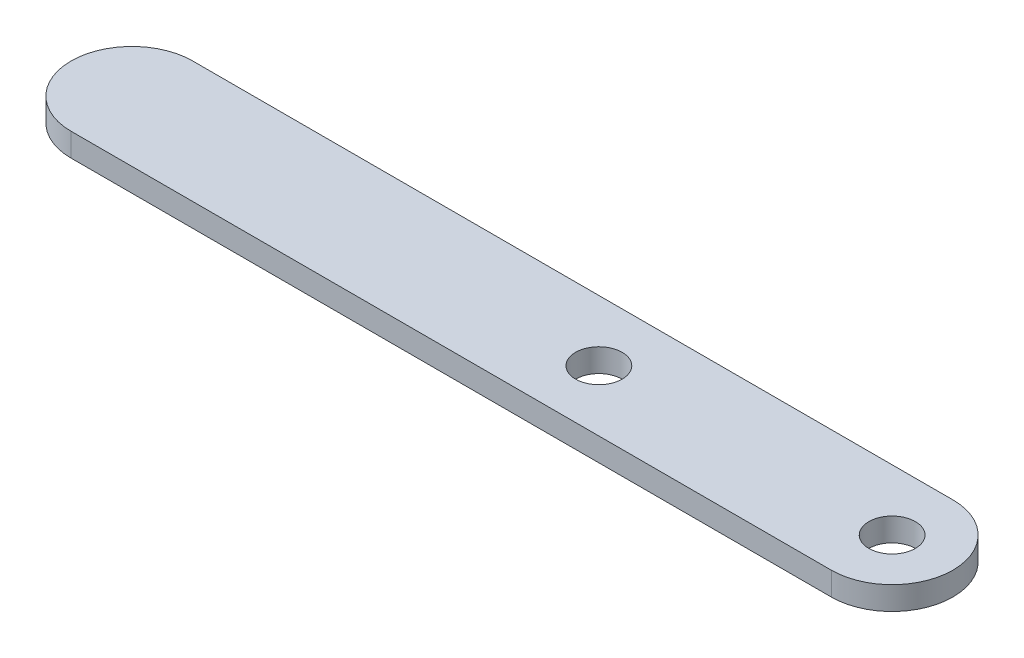
ISO-10303-21;
HEADER;
FILE_DESCRIPTION(('STEP AP214'),'2;1');
FILE_NAME('part.step','',(''),(''),'','','');
FILE_SCHEMA(('AUTOMOTIVE_DESIGN { 1 0 10303 214 1 1 1 1 }'));
ENDSEC;
DATA;
#1=APPLICATION_CONTEXT('core data for automotive mechanical design processes');
#2=APPLICATION_PROTOCOL_DEFINITION('international standard','automotive_design',2000,#1);
#3=PRODUCT_CONTEXT('',#1,'mechanical');
#4=PRODUCT('Part','Part','',(#3));
#5=PRODUCT_RELATED_PRODUCT_CATEGORY('part','',(#4));
#6=PRODUCT_DEFINITION_FORMATION('','',#4);
#7=PRODUCT_DEFINITION_CONTEXT('part definition',#1,'design');
#8=PRODUCT_DEFINITION('design','',#6,#7);
#9=PRODUCT_DEFINITION_SHAPE('','',#8);
#10=(LENGTH_UNIT() NAMED_UNIT(*) SI_UNIT(.MILLI.,.METRE.));
#11=(NAMED_UNIT(*) PLANE_ANGLE_UNIT() SI_UNIT($,.RADIAN.));
#12=(NAMED_UNIT(*) SI_UNIT($,.STERADIAN.) SOLID_ANGLE_UNIT());
#13=UNCERTAINTY_MEASURE_WITH_UNIT(LENGTH_MEASURE(1.E-05),#10,'distance_accuracy_value','');
#14=(GEOMETRIC_REPRESENTATION_CONTEXT(3) GLOBAL_UNCERTAINTY_ASSIGNED_CONTEXT((#13)) GLOBAL_UNIT_ASSIGNED_CONTEXT((#10,
#11,#12)) REPRESENTATION_CONTEXT('',''));
#15=CARTESIAN_POINT('',(0.,0.,0.));
#16=DIRECTION('',(0.,0.,1.));
#17=DIRECTION('',(1.,0.,0.));
#18=AXIS2_PLACEMENT_3D('',#15,#16,#17);
#19=CARTESIAN_POINT('',(28.,0.79375,0.));
#20=DIRECTION('',(0.,1.,0.));
#21=DIRECTION('',(0.,0.,1.));
#22=AXIS2_PLACEMENT_3D('',#19,#20,#21);
#23=PLANE('',#22);
#24=CARTESIAN_POINT('',(8.,0.79375,0.));
#25=DIRECTION('',(0.,1.,0.));
#26=DIRECTION('',(0.,0.,1.));
#27=AXIS2_PLACEMENT_3D('',#24,#25,#26);
#28=CIRCLE('',#27,1.5875);
#29=CARTESIAN_POINT('',(8.,0.79375,1.5875));
#30=VERTEX_POINT('',#29);
#31=EDGE_CURVE('E101',#30,#30,#28,.T.);
#32=ORIENTED_EDGE('',*,*,#31,.F.);
#33=EDGE_LOOP('',(#32));
#34=FACE_BOUND('',#33,.T.);
#35=CARTESIAN_POINT('',(28.,0.79375,0.));
#36=DIRECTION('',(0.,1.,0.));
#37=DIRECTION('',(0.,0.,1.));
#38=AXIS2_PLACEMENT_3D('',#35,#36,#37);
#39=CIRCLE('',#38,4.14999999999999);
#40=CARTESIAN_POINT('',(28.,0.79375,4.14999999999999));
#41=VERTEX_POINT('',#40);
#42=CARTESIAN_POINT('',(28.,0.79375,-4.14999999999999));
#43=VERTEX_POINT('',#42);
#44=EDGE_CURVE('E84',#41,#43,#39,.T.);
#45=ORIENTED_EDGE('',*,*,#44,.T.);
#46=DIRECTION('',(-1.,0.,0.));
#47=VECTOR('',#46,1.);
#48=CARTESIAN_POINT('',(28.,0.79375,-4.14999999999999));
#49=LINE('',#48,#47);
#50=CARTESIAN_POINT('',(-23.85,0.79375,-4.15));
#51=VERTEX_POINT('',#50);
#52=EDGE_CURVE('E78',#43,#51,#49,.T.);
#53=ORIENTED_EDGE('',*,*,#52,.T.);
#54=CARTESIAN_POINT('',(-23.85,0.79375,0.));
#55=DIRECTION('',(0.,1.,0.));
#56=DIRECTION('',(0.,0.,1.));
#57=AXIS2_PLACEMENT_3D('',#54,#55,#56);
#58=CIRCLE('',#57,4.15);
#59=CARTESIAN_POINT('',(-23.85,0.79375,4.15));
#60=VERTEX_POINT('',#59);
#61=EDGE_CURVE('E81',#51,#60,#58,.T.);
#62=ORIENTED_EDGE('',*,*,#61,.T.);
#63=DIRECTION('',(1.,0.,0.));
#64=VECTOR('',#63,1.);
#65=CARTESIAN_POINT('',(-23.85,0.79375,4.15));
#66=LINE('',#65,#64);
#67=EDGE_CURVE('E50',#60,#41,#66,.T.);
#68=ORIENTED_EDGE('',*,*,#67,.T.);
#69=EDGE_LOOP('',(#45,#53,#62,#68));
#70=FACE_BOUND('',#69,.T.);
#71=CARTESIAN_POINT('',(28.,0.79375,0.));
#72=DIRECTION('',(0.,1.,0.));
#73=DIRECTION('',(0.,0.,1.));
#74=AXIS2_PLACEMENT_3D('',#71,#72,#73);
#75=CIRCLE('',#74,1.5875);
#76=CARTESIAN_POINT('',(28.,0.79375,1.58749999999999));
#77=VERTEX_POINT('',#76);
#78=EDGE_CURVE('E113',#77,#77,#75,.T.);
#79=ORIENTED_EDGE('',*,*,#78,.F.);
#80=EDGE_LOOP('',(#79));
#81=FACE_BOUND('',#80,.T.);
#82=ADVANCED_FACE('F33',(#34,#70,#81),#23,.T.);
#83=CARTESIAN_POINT('',(28.,-0.79375,0.));
#84=DIRECTION('',(0.,1.,0.));
#85=DIRECTION('',(0.,0.,1.));
#86=AXIS2_PLACEMENT_3D('',#83,#84,#85);
#87=PLANE('',#86);
#88=CARTESIAN_POINT('',(8.,-0.79375,0.));
#89=DIRECTION('',(0.,1.,0.));
#90=DIRECTION('',(0.,0.,1.));
#91=AXIS2_PLACEMENT_3D('',#88,#89,#90);
#92=CIRCLE('',#91,1.5875);
#93=CARTESIAN_POINT('',(8.,-0.79375,1.5875));
#94=VERTEX_POINT('',#93);
#95=EDGE_CURVE('E110',#94,#94,#92,.T.);
#96=ORIENTED_EDGE('',*,*,#95,.T.);
#97=EDGE_LOOP('',(#96));
#98=FACE_BOUND('',#97,.T.);
#99=CARTESIAN_POINT('',(28.,-0.79375,0.));
#100=DIRECTION('',(0.,1.,0.));
#101=DIRECTION('',(0.,0.,1.));
#102=AXIS2_PLACEMENT_3D('',#99,#100,#101);
#103=CIRCLE('',#102,4.14999999999999);
#104=CARTESIAN_POINT('',(28.,-0.79375,4.14999999999999));
#105=VERTEX_POINT('',#104);
#106=CARTESIAN_POINT('',(28.,-0.79375,-4.14999999999999));
#107=VERTEX_POINT('',#106);
#108=EDGE_CURVE('E98',#105,#107,#103,.T.);
#109=ORIENTED_EDGE('',*,*,#108,.F.);
#110=DIRECTION('',(1.,0.,0.));
#111=VECTOR('',#110,1.);
#112=CARTESIAN_POINT('',(8.,-0.79375,4.14999999999999));
#113=LINE('',#112,#111);
#114=CARTESIAN_POINT('',(-23.85,-0.79375,4.15));
#115=VERTEX_POINT('',#114);
#116=EDGE_CURVE('E67',#115,#105,#113,.T.);
#117=ORIENTED_EDGE('',*,*,#116,.F.);
#118=CARTESIAN_POINT('',(-23.85,-0.79375,0.));
#119=DIRECTION('',(0.,1.,0.));
#120=DIRECTION('',(0.,0.,1.));
#121=AXIS2_PLACEMENT_3D('',#118,#119,#120);
#122=CIRCLE('',#121,4.15);
#123=CARTESIAN_POINT('',(-23.85,-0.79375,-4.15));
#124=VERTEX_POINT('',#123);
#125=EDGE_CURVE('E103',#124,#115,#122,.T.);
#126=ORIENTED_EDGE('',*,*,#125,.F.);
#127=DIRECTION('',(-1.,0.,0.));
#128=VECTOR('',#127,1.);
#129=CARTESIAN_POINT('',(8.,-0.79375,-4.14999999999999));
#130=LINE('',#129,#128);
#131=EDGE_CURVE('E89',#107,#124,#130,.T.);
#132=ORIENTED_EDGE('',*,*,#131,.F.);
#133=EDGE_LOOP('',(#109,#117,#126,#132));
#134=FACE_BOUND('',#133,.T.);
#135=CARTESIAN_POINT('',(28.,-0.79375,0.));
#136=DIRECTION('',(0.,1.,0.));
#137=DIRECTION('',(0.,0.,1.));
#138=AXIS2_PLACEMENT_3D('',#135,#136,#137);
#139=CIRCLE('',#138,1.5875);
#140=CARTESIAN_POINT('',(28.,-0.79375,1.58749999999999));
#141=VERTEX_POINT('',#140);
#142=EDGE_CURVE('E116',#141,#141,#139,.T.);
#143=ORIENTED_EDGE('',*,*,#142,.T.);
#144=EDGE_LOOP('',(#143));
#145=FACE_BOUND('',#144,.T.);
#146=ADVANCED_FACE('F125',(#98,#134,#145),#87,.F.);
#147=CARTESIAN_POINT('',(28.,0.79375,0.));
#148=DIRECTION('',(0.,-1.,0.));
#149=DIRECTION('',(0.,0.,-1.));
#150=AXIS2_PLACEMENT_3D('',#147,#148,#149);
#151=CYLINDRICAL_SURFACE('',#150,4.14999999999999);
#152=ORIENTED_EDGE('',*,*,#108,.T.);
#153=DIRECTION('',(0.,-1.,0.));
#154=VECTOR('',#153,1.);
#155=CARTESIAN_POINT('',(28.,0.79375,-4.14999999999999));
#156=LINE('',#155,#154);
#157=EDGE_CURVE('E11',#43,#107,#156,.T.);
#158=ORIENTED_EDGE('',*,*,#157,.F.);
#159=ORIENTED_EDGE('',*,*,#44,.F.);
#160=DIRECTION('',(0.,-1.,0.));
#161=VECTOR('',#160,1.);
#162=CARTESIAN_POINT('',(28.,0.79375,4.14999999999999));
#163=LINE('',#162,#161);
#164=EDGE_CURVE('E94',#41,#105,#163,.T.);
#165=ORIENTED_EDGE('',*,*,#164,.T.);
#166=EDGE_LOOP('',(#152,#158,#159,#165));
#167=FACE_BOUND('',#166,.T.);
#168=ADVANCED_FACE('F35',(#167),#151,.T.);
#169=CARTESIAN_POINT('',(8.,0.79375,-4.14999999999999));
#170=DIRECTION('',(0.,0.,1.));
#171=DIRECTION('',(1.,0.,0.));
#172=AXIS2_PLACEMENT_3D('',#169,#170,#171);
#173=PLANE('',#172);
#174=ORIENTED_EDGE('',*,*,#131,.T.);
#175=DIRECTION('',(0.,-1.,0.));
#176=VECTOR('',#175,1.);
#177=CARTESIAN_POINT('',(-23.85,0.79375,-4.15));
#178=LINE('',#177,#176);
#179=EDGE_CURVE('E42',#51,#124,#178,.T.);
#180=ORIENTED_EDGE('',*,*,#179,.F.);
#181=ORIENTED_EDGE('',*,*,#52,.F.);
#182=ORIENTED_EDGE('',*,*,#157,.T.);
#183=EDGE_LOOP('',(#174,#180,#181,#182));
#184=FACE_BOUND('',#183,.T.);
#185=ADVANCED_FACE('F88',(#184),#173,.F.);
#186=CARTESIAN_POINT('',(-23.85,0.79375,0.));
#187=DIRECTION('',(0.,-1.,0.));
#188=DIRECTION('',(0.,0.,-1.));
#189=AXIS2_PLACEMENT_3D('',#186,#187,#188);
#190=CYLINDRICAL_SURFACE('',#189,4.15);
#191=ORIENTED_EDGE('',*,*,#125,.T.);
#192=DIRECTION('',(0.,-1.,0.));
#193=VECTOR('',#192,1.);
#194=CARTESIAN_POINT('',(-23.85,0.79375,4.15));
#195=LINE('',#194,#193);
#196=EDGE_CURVE('E91',#60,#115,#195,.T.);
#197=ORIENTED_EDGE('',*,*,#196,.F.);
#198=ORIENTED_EDGE('',*,*,#61,.F.);
#199=ORIENTED_EDGE('',*,*,#179,.T.);
#200=EDGE_LOOP('',(#191,#197,#198,#199));
#201=FACE_BOUND('',#200,.T.);
#202=ADVANCED_FACE('F92',(#201),#190,.T.);
#203=CARTESIAN_POINT('',(8.,0.79375,4.14999999999999));
#204=DIRECTION('',(0.,0.,-1.));
#205=DIRECTION('',(-1.,0.,0.));
#206=AXIS2_PLACEMENT_3D('',#203,#204,#205);
#207=PLANE('',#206);
#208=ORIENTED_EDGE('',*,*,#116,.T.);
#209=ORIENTED_EDGE('',*,*,#164,.F.);
#210=ORIENTED_EDGE('',*,*,#67,.F.);
#211=ORIENTED_EDGE('',*,*,#196,.T.);
#212=EDGE_LOOP('',(#208,#209,#210,#211));
#213=FACE_BOUND('',#212,.T.);
#214=ADVANCED_FACE('F107',(#213),#207,.F.);
#215=CARTESIAN_POINT('',(8.,0.79375,0.));
#216=DIRECTION('',(0.,-1.,0.));
#217=DIRECTION('',(0.,0.,-1.));
#218=AXIS2_PLACEMENT_3D('',#215,#216,#217);
#219=CYLINDRICAL_SURFACE('',#218,1.5875);
#220=ORIENTED_EDGE('',*,*,#31,.T.);
#221=EDGE_LOOP('',(#220));
#222=FACE_BOUND('',#221,.T.);
#223=ORIENTED_EDGE('',*,*,#95,.F.);
#224=EDGE_LOOP('',(#223));
#225=FACE_BOUND('',#224,.T.);
#226=ADVANCED_FACE('F135',(#222,#225),#219,.F.);
#227=CARTESIAN_POINT('',(28.,0.79375,0.));
#228=DIRECTION('',(0.,-1.,0.));
#229=DIRECTION('',(0.,0.,-1.));
#230=AXIS2_PLACEMENT_3D('',#227,#228,#229);
#231=CYLINDRICAL_SURFACE('',#230,1.5875);
#232=ORIENTED_EDGE('',*,*,#78,.T.);
#233=EDGE_LOOP('',(#232));
#234=FACE_BOUND('',#233,.T.);
#235=ORIENTED_EDGE('',*,*,#142,.F.);
#236=EDGE_LOOP('',(#235));
#237=FACE_BOUND('',#236,.T.);
#238=ADVANCED_FACE('F122',(#234,#237),#231,.F.);
#239=CLOSED_SHELL('',(#82,#146,#168,#185,#202,#214,#226,#238));
#240=MANIFOLD_SOLID_BREP('B2',#239);
#241=ADVANCED_BREP_SHAPE_REPRESENTATION('',(#18,#240),#14);
#242=SHAPE_DEFINITION_REPRESENTATION(#9,#241);
ENDSEC;
END-ISO-10303-21;
